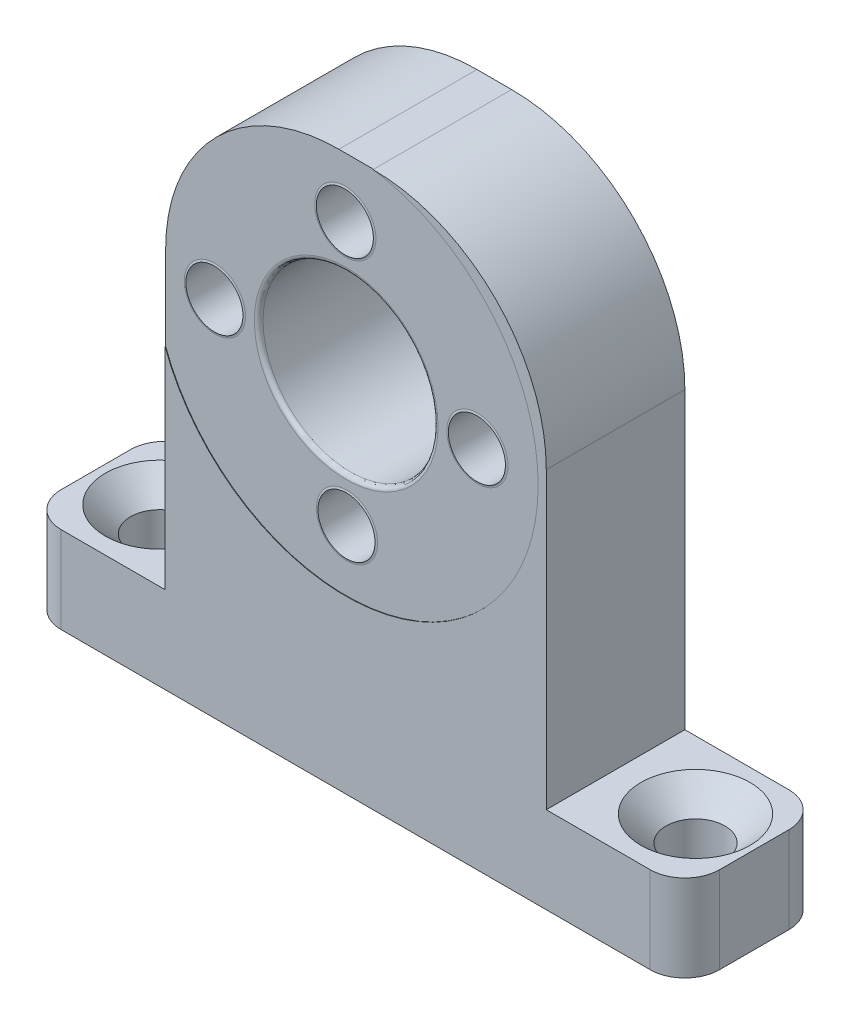
ISO-10303-21;
HEADER;
FILE_DESCRIPTION(('STEP AP214'),'2;1');
FILE_NAME('part.step','',(''),(''),'','','');
FILE_SCHEMA(('AUTOMOTIVE_DESIGN { 1 0 10303 214 1 1 1 1 }'));
ENDSEC;
DATA;
#1=APPLICATION_CONTEXT('core data for automotive mechanical design processes');
#2=APPLICATION_PROTOCOL_DEFINITION('international standard','automotive_design',2000,#1);
#3=PRODUCT_CONTEXT('',#1,'mechanical');
#4=PRODUCT('Part','Part','',(#3));
#5=PRODUCT_RELATED_PRODUCT_CATEGORY('part','',(#4));
#6=PRODUCT_DEFINITION_FORMATION('','',#4);
#7=PRODUCT_DEFINITION_CONTEXT('part definition',#1,'design');
#8=PRODUCT_DEFINITION('design','',#6,#7);
#9=PRODUCT_DEFINITION_SHAPE('','',#8);
#10=(LENGTH_UNIT() NAMED_UNIT(*) SI_UNIT(.MILLI.,.METRE.));
#11=(NAMED_UNIT(*) PLANE_ANGLE_UNIT() SI_UNIT($,.RADIAN.));
#12=(NAMED_UNIT(*) SI_UNIT($,.STERADIAN.) SOLID_ANGLE_UNIT());
#13=UNCERTAINTY_MEASURE_WITH_UNIT(LENGTH_MEASURE(1.E-05),#10,'distance_accuracy_value','');
#14=(GEOMETRIC_REPRESENTATION_CONTEXT(3) GLOBAL_UNCERTAINTY_ASSIGNED_CONTEXT((#13)) GLOBAL_UNIT_ASSIGNED_CONTEXT((#10,
#11,#12)) REPRESENTATION_CONTEXT('',''));
#15=CARTESIAN_POINT('',(0.,0.,0.));
#16=DIRECTION('',(0.,0.,1.));
#17=DIRECTION('',(1.,0.,0.));
#18=AXIS2_PLACEMENT_3D('',#15,#16,#17);
#19=CARTESIAN_POINT('',(0.,0.,8.));
#20=DIRECTION('',(1.,0.,0.));
#21=DIRECTION('',(0.,1.,0.));
#22=AXIS2_PLACEMENT_3D('',#19,#20,#21);
#23=PLANE('',#22);
#24=DIRECTION('',(0.,0.,1.));
#25=VECTOR('',#24,1.);
#26=CARTESIAN_POINT('',(0.,17.1450051665847,7.97));
#27=LINE('',#26,#25);
#28=CARTESIAN_POINT('',(0.,17.1450051665847,7.97));
#29=VERTEX_POINT('',#28);
#30=CARTESIAN_POINT('',(0.,17.1450051665847,8.));
#31=VERTEX_POINT('',#30);
#32=EDGE_CURVE('E217',#29,#31,#27,.T.);
#33=ORIENTED_EDGE('',*,*,#32,.F.);
#34=DIRECTION('',(0.,1.,0.));
#35=VECTOR('',#34,1.);
#36=CARTESIAN_POINT('',(0.,0.,7.97));
#37=LINE('',#36,#35);
#38=CARTESIAN_POINT('',(0.,22.,7.97));
#39=VERTEX_POINT('',#38);
#40=EDGE_CURVE('E72',#29,#39,#37,.T.);
#41=ORIENTED_EDGE('',*,*,#40,.T.);
#42=DIRECTION('',(0.,0.,-1.));
#43=VECTOR('',#42,1.);
#44=CARTESIAN_POINT('',(0.,21.9999999999999,8.));
#45=LINE('',#44,#43);
#46=CARTESIAN_POINT('',(0.,21.9999999999999,0.));
#47=VERTEX_POINT('',#46);
#48=EDGE_CURVE('E260',#39,#47,#45,.T.);
#49=ORIENTED_EDGE('',*,*,#48,.T.);
#50=DIRECTION('',(0.,-1.,0.));
#51=VECTOR('',#50,1.);
#52=CARTESIAN_POINT('',(0.,0.,0.));
#53=LINE('',#52,#51);
#54=CARTESIAN_POINT('',(0.,5.,0.));
#55=VERTEX_POINT('',#54);
#56=EDGE_CURVE('E263',#47,#55,#53,.T.);
#57=ORIENTED_EDGE('',*,*,#56,.T.);
#58=DIRECTION('',(0.,0.,1.));
#59=VECTOR('',#58,1.);
#60=CARTESIAN_POINT('',(0.,5.,0.));
#61=LINE('',#60,#59);
#62=CARTESIAN_POINT('',(0.,5.,8.));
#63=VERTEX_POINT('',#62);
#64=EDGE_CURVE('E255',#55,#63,#61,.T.);
#65=ORIENTED_EDGE('',*,*,#64,.T.);
#66=DIRECTION('',(0.,-1.,0.));
#67=VECTOR('',#66,1.);
#68=CARTESIAN_POINT('',(0.,0.,8.));
#69=LINE('',#68,#67);
#70=EDGE_CURVE('E291',#31,#63,#69,.T.);
#71=ORIENTED_EDGE('',*,*,#70,.F.);
#72=EDGE_LOOP('',(#33,#41,#49,#57,#65,#71));
#73=FACE_BOUND('',#72,.T.);
#74=ADVANCED_FACE('F38',(#73),#23,.F.);
#75=CARTESIAN_POINT('',(10.0000000000001,32.,8.));
#76=DIRECTION('',(0.,-1.,0.));
#77=DIRECTION('',(0.,0.,-1.));
#78=AXIS2_PLACEMENT_3D('',#75,#76,#77);
#79=PLANE('',#78);
#80=DIRECTION('',(0.,0.,1.));
#81=VECTOR('',#80,1.);
#82=CARTESIAN_POINT('',(11.9792655467795,32.,7.97));
#83=LINE('',#82,#81);
#84=CARTESIAN_POINT('',(11.9792655467795,32.,8.));
#85=VERTEX_POINT('',#84);
#86=CARTESIAN_POINT('',(11.9792655467795,32.,7.97));
#87=VERTEX_POINT('',#86);
#88=EDGE_CURVE('E56',#85,#87,#83,.F.);
#89=ORIENTED_EDGE('',*,*,#88,.F.);
#90=DIRECTION('',(-1.,0.,0.));
#91=VECTOR('',#90,1.);
#92=CARTESIAN_POINT('',(10.0000000000001,32.,8.));
#93=LINE('',#92,#91);
#94=CARTESIAN_POINT('',(11.9999999999999,32.,8.));
#95=VERTEX_POINT('',#94);
#96=EDGE_CURVE('E227',#95,#85,#93,.T.);
#97=ORIENTED_EDGE('',*,*,#96,.F.);
#98=DIRECTION('',(0.,0.,-1.));
#99=VECTOR('',#98,1.);
#100=CARTESIAN_POINT('',(11.9999999999999,32.,8.));
#101=LINE('',#100,#99);
#102=CARTESIAN_POINT('',(11.9999999999999,32.,0.));
#103=VERTEX_POINT('',#102);
#104=EDGE_CURVE('E250',#95,#103,#101,.T.);
#105=ORIENTED_EDGE('',*,*,#104,.T.);
#106=DIRECTION('',(-1.,0.,0.));
#107=VECTOR('',#106,1.);
#108=CARTESIAN_POINT('',(10.0000000000001,32.,0.));
#109=LINE('',#108,#107);
#110=CARTESIAN_POINT('',(10.0000000000001,32.,0.));
#111=VERTEX_POINT('',#110);
#112=EDGE_CURVE('E254',#103,#111,#109,.T.);
#113=ORIENTED_EDGE('',*,*,#112,.T.);
#114=DIRECTION('',(0.,0.,-1.));
#115=VECTOR('',#114,1.);
#116=CARTESIAN_POINT('',(10.0000000000001,32.,8.));
#117=LINE('',#116,#115);
#118=CARTESIAN_POINT('',(10.0000000000001,32.,7.97));
#119=VERTEX_POINT('',#118);
#120=EDGE_CURVE('E256',#119,#111,#117,.T.);
#121=ORIENTED_EDGE('',*,*,#120,.F.);
#122=DIRECTION('',(1.,0.,0.));
#123=VECTOR('',#122,1.);
#124=CARTESIAN_POINT('',(10.0000000000001,32.,7.97));
#125=LINE('',#124,#123);
#126=EDGE_CURVE('E79',#119,#87,#125,.T.);
#127=ORIENTED_EDGE('',*,*,#126,.T.);
#128=EDGE_LOOP('',(#89,#97,#105,#113,#121,#127));
#129=FACE_BOUND('',#128,.T.);
#130=ADVANCED_FACE('F402',(#129),#79,.F.);
#131=CARTESIAN_POINT('',(9.99999999999999,22.,8.));
#132=DIRECTION('',(0.,0.,-1.));
#133=DIRECTION('',(-1.,0.,0.));
#134=AXIS2_PLACEMENT_3D('',#131,#132,#133);
#135=PLANE('',#134);
#136=CARTESIAN_POINT('',(10.4197463901163,21.,8.));
#137=DIRECTION('',(0.,0.,-1.));
#138=DIRECTION('',(-1.,0.,0.));
#139=AXIS2_PLACEMENT_3D('',#136,#137,#138);
#140=CIRCLE('',#139,11.11);
#141=EDGE_CURVE('E62',#31,#85,#140,.F.);
#142=ORIENTED_EDGE('',*,*,#141,.F.);
#143=ORIENTED_EDGE('',*,*,#70,.T.);
#144=DIRECTION('',(-1.,0.,0.));
#145=VECTOR('',#144,1.);
#146=CARTESIAN_POINT('',(0.,5.,8.));
#147=LINE('',#146,#145);
#148=CARTESIAN_POINT('',(-6.,5.,8.));
#149=VERTEX_POINT('',#148);
#150=EDGE_CURVE('E205',#63,#149,#147,.T.);
#151=ORIENTED_EDGE('',*,*,#150,.T.);
#152=DIRECTION('',(0.,-1.,0.));
#153=VECTOR('',#152,1.);
#154=CARTESIAN_POINT('',(-6.,0.,8.));
#155=LINE('',#154,#153);
#156=CARTESIAN_POINT('',(-6.,0.,8.));
#157=VERTEX_POINT('',#156);
#158=EDGE_CURVE('E200',#149,#157,#155,.T.);
#159=ORIENTED_EDGE('',*,*,#158,.T.);
#160=DIRECTION('',(1.,0.,0.));
#161=VECTOR('',#160,1.);
#162=CARTESIAN_POINT('',(0.,0.,8.));
#163=LINE('',#162,#161);
#164=CARTESIAN_POINT('',(28.,0.,8.));
#165=VERTEX_POINT('',#164);
#166=EDGE_CURVE('E204',#157,#165,#163,.T.);
#167=ORIENTED_EDGE('',*,*,#166,.T.);
#168=DIRECTION('',(0.,1.,0.));
#169=VECTOR('',#168,1.);
#170=CARTESIAN_POINT('',(28.,5.,8.));
#171=LINE('',#170,#169);
#172=CARTESIAN_POINT('',(28.,5.,8.));
#173=VERTEX_POINT('',#172);
#174=EDGE_CURVE('E206',#165,#173,#171,.T.);
#175=ORIENTED_EDGE('',*,*,#174,.T.);
#176=DIRECTION('',(-1.,0.,0.));
#177=VECTOR('',#176,1.);
#178=CARTESIAN_POINT('',(22.,5.,8.));
#179=LINE('',#178,#177);
#180=CARTESIAN_POINT('',(22.,5.,8.));
#181=VERTEX_POINT('',#180);
#182=EDGE_CURVE('E165',#173,#181,#179,.T.);
#183=ORIENTED_EDGE('',*,*,#182,.T.);
#184=DIRECTION('',(0.,1.,0.));
#185=VECTOR('',#184,1.);
#186=CARTESIAN_POINT('',(22.,0.,8.));
#187=LINE('',#186,#185);
#188=CARTESIAN_POINT('',(22.,21.9999999999999,8.));
#189=VERTEX_POINT('',#188);
#190=EDGE_CURVE('E285',#181,#189,#187,.T.);
#191=ORIENTED_EDGE('',*,*,#190,.T.);
#192=CARTESIAN_POINT('',(12.,22.,8.));
#193=DIRECTION('',(0.,0.,1.));
#194=DIRECTION('',(-1.,0.,0.));
#195=AXIS2_PLACEMENT_3D('',#192,#193,#194);
#196=CIRCLE('',#195,10.);
#197=EDGE_CURVE('E282',#189,#95,#196,.T.);
#198=ORIENTED_EDGE('',*,*,#197,.T.);
#199=ORIENTED_EDGE('',*,*,#96,.T.);
#200=EDGE_LOOP('',(#142,#143,#151,#159,#167,#175,#183,#191,#198,#199));
#201=FACE_BOUND('',#200,.T.);
#202=ADVANCED_FACE('F40',(#201),#135,.F.);
#203=CARTESIAN_POINT('',(0.,0.,8.));
#204=DIRECTION('',(0.,1.,0.));
#205=DIRECTION('',(0.,0.,1.));
#206=AXIS2_PLACEMENT_3D('',#203,#204,#205);
#207=PLANE('',#206);
#208=CARTESIAN_POINT('',(-4.39851416286659,0.,3.90318258406556));
#209=DIRECTION('',(0.,1.,0.));
#210=DIRECTION('',(0.,0.,1.));
#211=AXIS2_PLACEMENT_3D('',#208,#209,#210);
#212=CIRCLE('',#211,1.69999999999999);
#213=CARTESIAN_POINT('',(-4.39851416286659,0.,5.60318258406555));
#214=VERTEX_POINT('',#213);
#215=EDGE_CURVE('E42',#214,#214,#212,.T.);
#216=ORIENTED_EDGE('',*,*,#215,.T.);
#217=EDGE_LOOP('',(#216));
#218=FACE_BOUND('',#217,.T.);
#219=CARTESIAN_POINT('',(26.5165104399769,0.,3.90318258406556));
#220=DIRECTION('',(0.,1.,0.));
#221=DIRECTION('',(0.,0.,1.));
#222=AXIS2_PLACEMENT_3D('',#219,#220,#221);
#223=CIRCLE('',#222,1.69999999999999);
#224=CARTESIAN_POINT('',(26.5165104399769,0.,5.60318258406555));
#225=VERTEX_POINT('',#224);
#226=EDGE_CURVE('E347',#225,#225,#223,.T.);
#227=ORIENTED_EDGE('',*,*,#226,.T.);
#228=EDGE_LOOP('',(#227));
#229=FACE_BOUND('',#228,.T.);
#230=DIRECTION('',(0.,0.,1.));
#231=VECTOR('',#230,1.);
#232=CARTESIAN_POINT('',(-8.,0.,0.));
#233=LINE('',#232,#231);
#234=CARTESIAN_POINT('',(-8.,0.,2.));
#235=VERTEX_POINT('',#234);
#236=CARTESIAN_POINT('',(-8.,0.,6.));
#237=VERTEX_POINT('',#236);
#238=EDGE_CURVE('E241',#235,#237,#233,.T.);
#239=ORIENTED_EDGE('',*,*,#238,.F.);
#240=CARTESIAN_POINT('',(-6.,0.,2.));
#241=DIRECTION('',(0.,1.,0.));
#242=DIRECTION('',(0.,0.,1.));
#243=AXIS2_PLACEMENT_3D('',#240,#241,#242);
#244=CIRCLE('',#243,2.);
#245=CARTESIAN_POINT('',(-6.,0.,0.));
#246=VERTEX_POINT('',#245);
#247=EDGE_CURVE('E223',#235,#246,#244,.F.);
#248=ORIENTED_EDGE('',*,*,#247,.T.);
#249=DIRECTION('',(1.,0.,0.));
#250=VECTOR('',#249,1.);
#251=CARTESIAN_POINT('',(0.,0.,0.));
#252=LINE('',#251,#250);
#253=CARTESIAN_POINT('',(28.,0.,0.));
#254=VERTEX_POINT('',#253);
#255=EDGE_CURVE('E226',#246,#254,#252,.T.);
#256=ORIENTED_EDGE('',*,*,#255,.T.);
#257=CARTESIAN_POINT('',(28.,0.,2.));
#258=DIRECTION('',(0.,1.,0.));
#259=DIRECTION('',(0.,0.,1.));
#260=AXIS2_PLACEMENT_3D('',#257,#258,#259);
#261=CIRCLE('',#260,2.);
#262=CARTESIAN_POINT('',(30.,0.,2.));
#263=VERTEX_POINT('',#262);
#264=EDGE_CURVE('E235',#254,#263,#261,.F.);
#265=ORIENTED_EDGE('',*,*,#264,.T.);
#266=DIRECTION('',(0.,0.,1.));
#267=VECTOR('',#266,1.);
#268=CARTESIAN_POINT('',(30.,0.,0.));
#269=LINE('',#268,#267);
#270=CARTESIAN_POINT('',(30.,0.,6.));
#271=VERTEX_POINT('',#270);
#272=EDGE_CURVE('E234',#263,#271,#269,.T.);
#273=ORIENTED_EDGE('',*,*,#272,.T.);
#274=CARTESIAN_POINT('',(28.,0.,6.));
#275=DIRECTION('',(0.,1.,0.));
#276=DIRECTION('',(0.,0.,1.));
#277=AXIS2_PLACEMENT_3D('',#274,#275,#276);
#278=CIRCLE('',#277,2.);
#279=EDGE_CURVE('E187',#271,#165,#278,.F.);
#280=ORIENTED_EDGE('',*,*,#279,.T.);
#281=ORIENTED_EDGE('',*,*,#166,.F.);
#282=CARTESIAN_POINT('',(-6.,0.,6.));
#283=DIRECTION('',(0.,1.,0.));
#284=DIRECTION('',(0.,0.,1.));
#285=AXIS2_PLACEMENT_3D('',#282,#283,#284);
#286=CIRCLE('',#285,2.);
#287=EDGE_CURVE('E228',#157,#237,#286,.F.);
#288=ORIENTED_EDGE('',*,*,#287,.T.);
#289=EDGE_LOOP('',(#239,#248,#256,#265,#273,#280,#281,#288));
#290=FACE_BOUND('',#289,.T.);
#291=ADVANCED_FACE('F430',(#218,#229,#290),#207,.F.);
#292=CARTESIAN_POINT('',(22.,0.,8.));
#293=DIRECTION('',(-1.,0.,0.));
#294=DIRECTION('',(0.,-1.,0.));
#295=AXIS2_PLACEMENT_3D('',#292,#293,#294);
#296=PLANE('',#295);
#297=ORIENTED_EDGE('',*,*,#190,.F.);
#298=DIRECTION('',(0.,0.,1.));
#299=VECTOR('',#298,1.);
#300=CARTESIAN_POINT('',(22.,5.,0.));
#301=LINE('',#300,#299);
#302=CARTESIAN_POINT('',(22.,5.,0.));
#303=VERTEX_POINT('',#302);
#304=EDGE_CURVE('E183',#303,#181,#301,.T.);
#305=ORIENTED_EDGE('',*,*,#304,.F.);
#306=DIRECTION('',(0.,1.,0.));
#307=VECTOR('',#306,1.);
#308=CARTESIAN_POINT('',(22.,0.,0.));
#309=LINE('',#308,#307);
#310=CARTESIAN_POINT('',(22.,21.9999999999999,0.));
#311=VERTEX_POINT('',#310);
#312=EDGE_CURVE('E231',#303,#311,#309,.T.);
#313=ORIENTED_EDGE('',*,*,#312,.T.);
#314=DIRECTION('',(0.,0.,-1.));
#315=VECTOR('',#314,1.);
#316=CARTESIAN_POINT('',(22.,21.9999999999999,8.));
#317=LINE('',#316,#315);
#318=EDGE_CURVE('E245',#189,#311,#317,.T.);
#319=ORIENTED_EDGE('',*,*,#318,.F.);
#320=EDGE_LOOP('',(#297,#305,#313,#319));
#321=FACE_BOUND('',#320,.T.);
#322=ADVANCED_FACE('F448',(#321),#296,.F.);
#323=CARTESIAN_POINT('',(12.,22.,8.));
#324=DIRECTION('',(0.,0.,-1.));
#325=DIRECTION('',(-1.,0.,0.));
#326=AXIS2_PLACEMENT_3D('',#323,#324,#325);
#327=CYLINDRICAL_SURFACE('',#326,10.);
#328=CARTESIAN_POINT('',(12.,22.,0.));
#329=DIRECTION('',(0.,0.,1.));
#330=DIRECTION('',(-1.,0.,0.));
#331=AXIS2_PLACEMENT_3D('',#328,#329,#330);
#332=CIRCLE('',#331,10.);
#333=EDGE_CURVE('E249',#311,#103,#332,.T.);
#334=ORIENTED_EDGE('',*,*,#333,.T.);
#335=ORIENTED_EDGE('',*,*,#104,.F.);
#336=ORIENTED_EDGE('',*,*,#197,.F.);
#337=ORIENTED_EDGE('',*,*,#318,.T.);
#338=EDGE_LOOP('',(#334,#335,#336,#337));
#339=FACE_BOUND('',#338,.T.);
#340=ADVANCED_FACE('F451',(#339),#327,.T.);
#341=CARTESIAN_POINT('',(9.99999999999999,22.,8.));
#342=DIRECTION('',(0.,0.,-1.));
#343=DIRECTION('',(-1.,0.,0.));
#344=AXIS2_PLACEMENT_3D('',#341,#342,#343);
#345=CYLINDRICAL_SURFACE('',#344,10.);
#346=ORIENTED_EDGE('',*,*,#48,.F.);
#347=CARTESIAN_POINT('',(9.99999999999999,22.,7.97));
#348=DIRECTION('',(0.,0.,-1.));
#349=DIRECTION('',(-1.,0.,0.));
#350=AXIS2_PLACEMENT_3D('',#347,#348,#349);
#351=CIRCLE('',#350,10.);
#352=EDGE_CURVE('E76',#39,#119,#351,.T.);
#353=ORIENTED_EDGE('',*,*,#352,.T.);
#354=ORIENTED_EDGE('',*,*,#120,.T.);
#355=CARTESIAN_POINT('',(9.99999999999999,22.,0.));
#356=DIRECTION('',(0.,0.,1.));
#357=DIRECTION('',(-1.,0.,0.));
#358=AXIS2_PLACEMENT_3D('',#355,#356,#357);
#359=CIRCLE('',#358,10.);
#360=EDGE_CURVE('E259',#111,#47,#359,.T.);
#361=ORIENTED_EDGE('',*,*,#360,.T.);
#362=EDGE_LOOP('',(#346,#353,#354,#361));
#363=FACE_BOUND('',#362,.T.);
#364=ADVANCED_FACE('F400',(#363),#345,.T.);
#365=CARTESIAN_POINT('',(9.99999999999999,22.,0.));
#366=DIRECTION('',(0.,0.,-1.));
#367=DIRECTION('',(-1.,0.,0.));
#368=AXIS2_PLACEMENT_3D('',#365,#366,#367);
#369=PLANE('',#368);
#370=CARTESIAN_POINT('',(10.3716037784549,28.5747618244784,0.));
#371=DIRECTION('',(0.,0.,-1.));
#372=DIRECTION('',(-1.,0.,0.));
#373=AXIS2_PLACEMENT_3D('',#370,#371,#372);
#374=CIRCLE('',#373,1.64812663613721);
#375=CARTESIAN_POINT('',(8.72347714231774,28.5747618244784,0.));
#376=VERTEX_POINT('',#375);
#377=EDGE_CURVE('E384',#376,#376,#374,.F.);
#378=ORIENTED_EDGE('',*,*,#377,.T.);
#379=EDGE_LOOP('',(#378));
#380=FACE_BOUND('',#379,.T.);
#381=CARTESIAN_POINT('',(17.9945082145949,21.0481426116611,0.));
#382=DIRECTION('',(0.,0.,-1.));
#383=DIRECTION('',(-1.,0.,0.));
#384=AXIS2_PLACEMENT_3D('',#381,#382,#383);
#385=CIRCLE('',#384,1.64812663613686);
#386=CARTESIAN_POINT('',(16.346381578458,21.0481426116611,0.));
#387=VERTEX_POINT('',#386);
#388=EDGE_CURVE('E319',#387,#387,#385,.F.);
#389=ORIENTED_EDGE('',*,*,#388,.T.);
#390=EDGE_LOOP('',(#389));
#391=FACE_BOUND('',#390,.T.);
#392=CARTESIAN_POINT('',(10.4678890017777,13.4252381755212,0.));
#393=DIRECTION('',(0.,0.,-1.));
#394=DIRECTION('',(-1.,0.,0.));
#395=AXIS2_PLACEMENT_3D('',#392,#393,#394);
#396=CIRCLE('',#395,1.64812663613703);
#397=CARTESIAN_POINT('',(8.81976236564062,13.4252381755212,0.));
#398=VERTEX_POINT('',#397);
#399=EDGE_CURVE('E357',#398,#398,#396,.F.);
#400=ORIENTED_EDGE('',*,*,#399,.T.);
#401=EDGE_LOOP('',(#400));
#402=FACE_BOUND('',#401,.T.);
#403=CARTESIAN_POINT('',(2.8449845656377,20.9518573883384,0.));
#404=DIRECTION('',(0.,0.,-1.));
#405=DIRECTION('',(-1.,0.,0.));
#406=AXIS2_PLACEMENT_3D('',#403,#404,#405);
#407=CIRCLE('',#406,1.64812663613732);
#408=CARTESIAN_POINT('',(1.19685792950037,20.9518573883384,0.));
#409=VERTEX_POINT('',#408);
#410=EDGE_CURVE('E376',#409,#409,#407,.F.);
#411=ORIENTED_EDGE('',*,*,#410,.T.);
#412=EDGE_LOOP('',(#411));
#413=FACE_BOUND('',#412,.T.);
#414=CARTESIAN_POINT('',(10.4197463901163,21.,0.));
#415=DIRECTION('',(0.,0.,-1.));
#416=DIRECTION('',(-1.,0.,0.));
#417=AXIS2_PLACEMENT_3D('',#414,#415,#416);
#418=CIRCLE('',#417,5.05);
#419=CARTESIAN_POINT('',(5.3697463901163,21.,0.));
#420=VERTEX_POINT('',#419);
#421=EDGE_CURVE('E194',#420,#420,#418,.F.);
#422=ORIENTED_EDGE('',*,*,#421,.T.);
#423=EDGE_LOOP('',(#422));
#424=FACE_BOUND('',#423,.T.);
#425=ORIENTED_EDGE('',*,*,#255,.F.);
#426=DIRECTION('',(0.,-1.,0.));
#427=VECTOR('',#426,1.);
#428=CARTESIAN_POINT('',(-6.,22.,0.));
#429=LINE('',#428,#427);
#430=CARTESIAN_POINT('',(-6.,5.,0.));
#431=VERTEX_POINT('',#430);
#432=EDGE_CURVE('E218',#246,#431,#429,.F.);
#433=ORIENTED_EDGE('',*,*,#432,.T.);
#434=DIRECTION('',(-1.,0.,0.));
#435=VECTOR('',#434,1.);
#436=CARTESIAN_POINT('',(0.,5.,0.));
#437=LINE('',#436,#435);
#438=EDGE_CURVE('E213',#55,#431,#437,.T.);
#439=ORIENTED_EDGE('',*,*,#438,.F.);
#440=ORIENTED_EDGE('',*,*,#56,.F.);
#441=ORIENTED_EDGE('',*,*,#360,.F.);
#442=ORIENTED_EDGE('',*,*,#112,.F.);
#443=ORIENTED_EDGE('',*,*,#333,.F.);
#444=ORIENTED_EDGE('',*,*,#312,.F.);
#445=DIRECTION('',(-1.,0.,0.));
#446=VECTOR('',#445,1.);
#447=CARTESIAN_POINT('',(22.,5.,0.));
#448=LINE('',#447,#446);
#449=CARTESIAN_POINT('',(28.,5.,0.));
#450=VERTEX_POINT('',#449);
#451=EDGE_CURVE('E199',#450,#303,#448,.T.);
#452=ORIENTED_EDGE('',*,*,#451,.F.);
#453=DIRECTION('',(0.,1.,0.));
#454=VECTOR('',#453,1.);
#455=CARTESIAN_POINT('',(28.,22.,0.));
#456=LINE('',#455,#454);
#457=EDGE_CURVE('E172',#450,#254,#456,.F.);
#458=ORIENTED_EDGE('',*,*,#457,.T.);
#459=EDGE_LOOP('',(#425,#433,#439,#440,#441,#442,#443,#444,#452,#458));
#460=FACE_BOUND('',#459,.T.);
#461=ADVANCED_FACE('F411',(#380,#391,#402,#413,#424,#460),#369,.T.);
#462=CARTESIAN_POINT('',(22.,5.,0.));
#463=DIRECTION('',(0.,1.,0.));
#464=DIRECTION('',(0.,0.,1.));
#465=AXIS2_PLACEMENT_3D('',#462,#463,#464);
#466=PLANE('',#465);
#467=CARTESIAN_POINT('',(26.5165104399769,5.,3.90318258406556));
#468=DIRECTION('',(0.,1.,0.));
#469=DIRECTION('',(0.,0.,1.));
#470=AXIS2_PLACEMENT_3D('',#467,#468,#469);
#471=CIRCLE('',#470,3.15);
#472=CARTESIAN_POINT('',(26.5165104399769,5.,7.05318258406556));
#473=VERTEX_POINT('',#472);
#474=EDGE_CURVE('E360',#473,#473,#471,.T.);
#475=ORIENTED_EDGE('',*,*,#474,.F.);
#476=EDGE_LOOP('',(#475));
#477=FACE_BOUND('',#476,.T.);
#478=ORIENTED_EDGE('',*,*,#182,.F.);
#479=CARTESIAN_POINT('',(28.,5.,6.));
#480=DIRECTION('',(0.,1.,0.));
#481=DIRECTION('',(0.,0.,1.));
#482=AXIS2_PLACEMENT_3D('',#479,#480,#481);
#483=CIRCLE('',#482,2.);
#484=CARTESIAN_POINT('',(30.,5.,6.));
#485=VERTEX_POINT('',#484);
#486=EDGE_CURVE('E160',#173,#485,#483,.T.);
#487=ORIENTED_EDGE('',*,*,#486,.T.);
#488=DIRECTION('',(0.,0.,1.));
#489=VECTOR('',#488,1.);
#490=CARTESIAN_POINT('',(30.,5.,0.));
#491=LINE('',#490,#489);
#492=CARTESIAN_POINT('',(30.,5.,2.));
#493=VERTEX_POINT('',#492);
#494=EDGE_CURVE('E163',#493,#485,#491,.T.);
#495=ORIENTED_EDGE('',*,*,#494,.F.);
#496=CARTESIAN_POINT('',(28.,5.,2.));
#497=DIRECTION('',(0.,1.,0.));
#498=DIRECTION('',(0.,0.,1.));
#499=AXIS2_PLACEMENT_3D('',#496,#497,#498);
#500=CIRCLE('',#499,2.);
#501=EDGE_CURVE('E171',#493,#450,#500,.T.);
#502=ORIENTED_EDGE('',*,*,#501,.T.);
#503=ORIENTED_EDGE('',*,*,#451,.T.);
#504=ORIENTED_EDGE('',*,*,#304,.T.);
#505=EDGE_LOOP('',(#478,#487,#495,#502,#503,#504));
#506=FACE_BOUND('',#505,.T.);
#507=ADVANCED_FACE('F162',(#477,#506),#466,.T.);
#508=CARTESIAN_POINT('',(30.,0.,0.));
#509=DIRECTION('',(1.,0.,0.));
#510=DIRECTION('',(0.,0.,-1.));
#511=AXIS2_PLACEMENT_3D('',#508,#509,#510);
#512=PLANE('',#511);
#513=ORIENTED_EDGE('',*,*,#494,.T.);
#514=DIRECTION('',(0.,1.,0.));
#515=VECTOR('',#514,1.);
#516=CARTESIAN_POINT('',(30.,0.,6.));
#517=LINE('',#516,#515);
#518=EDGE_CURVE('E178',#485,#271,#517,.F.);
#519=ORIENTED_EDGE('',*,*,#518,.T.);
#520=ORIENTED_EDGE('',*,*,#272,.F.);
#521=DIRECTION('',(0.,1.,0.));
#522=VECTOR('',#521,1.);
#523=CARTESIAN_POINT('',(30.,0.,2.));
#524=LINE('',#523,#522);
#525=EDGE_CURVE('E181',#263,#493,#524,.T.);
#526=ORIENTED_EDGE('',*,*,#525,.T.);
#527=EDGE_LOOP('',(#513,#519,#520,#526));
#528=FACE_BOUND('',#527,.T.);
#529=ADVANCED_FACE('F176',(#528),#512,.T.);
#530=CARTESIAN_POINT('',(-8.,0.,0.));
#531=DIRECTION('',(-1.,0.,0.));
#532=DIRECTION('',(0.,0.,1.));
#533=AXIS2_PLACEMENT_3D('',#530,#531,#532);
#534=PLANE('',#533);
#535=DIRECTION('',(0.,0.,1.));
#536=VECTOR('',#535,1.);
#537=CARTESIAN_POINT('',(-8.,5.,0.));
#538=LINE('',#537,#536);
#539=CARTESIAN_POINT('',(-8.,5.,2.));
#540=VERTEX_POINT('',#539);
#541=CARTESIAN_POINT('',(-8.,5.,6.));
#542=VERTEX_POINT('',#541);
#543=EDGE_CURVE('E212',#540,#542,#538,.T.);
#544=ORIENTED_EDGE('',*,*,#543,.F.);
#545=DIRECTION('',(0.,-1.,0.));
#546=VECTOR('',#545,1.);
#547=CARTESIAN_POINT('',(-8.,0.,2.));
#548=LINE('',#547,#546);
#549=EDGE_CURVE('E191',#540,#235,#548,.T.);
#550=ORIENTED_EDGE('',*,*,#549,.T.);
#551=ORIENTED_EDGE('',*,*,#238,.T.);
#552=DIRECTION('',(0.,-1.,0.));
#553=VECTOR('',#552,1.);
#554=CARTESIAN_POINT('',(-8.,5.,6.));
#555=LINE('',#554,#553);
#556=EDGE_CURVE('E242',#237,#542,#555,.F.);
#557=ORIENTED_EDGE('',*,*,#556,.T.);
#558=EDGE_LOOP('',(#544,#550,#551,#557));
#559=FACE_BOUND('',#558,.T.);
#560=ADVANCED_FACE('F433',(#559),#534,.T.);
#561=CARTESIAN_POINT('',(0.,5.,0.));
#562=DIRECTION('',(0.,1.,0.));
#563=DIRECTION('',(-1.,0.,0.));
#564=AXIS2_PLACEMENT_3D('',#561,#562,#563);
#565=PLANE('',#564);
#566=CARTESIAN_POINT('',(-4.39851416286659,5.,3.90318258406556));
#567=DIRECTION('',(0.,1.,0.));
#568=DIRECTION('',(0.,0.,1.));
#569=AXIS2_PLACEMENT_3D('',#566,#567,#568);
#570=CIRCLE('',#569,3.15);
#571=CARTESIAN_POINT('',(-4.39851416286659,5.,7.05318258406556));
#572=VERTEX_POINT('',#571);
#573=EDGE_CURVE('E783',#572,#572,#570,.T.);
#574=ORIENTED_EDGE('',*,*,#573,.F.);
#575=EDGE_LOOP('',(#574));
#576=FACE_BOUND('',#575,.T.);
#577=ORIENTED_EDGE('',*,*,#438,.T.);
#578=CARTESIAN_POINT('',(-6.,5.,2.));
#579=DIRECTION('',(0.,1.,0.));
#580=DIRECTION('',(-1.,0.,0.));
#581=AXIS2_PLACEMENT_3D('',#578,#579,#580);
#582=CIRCLE('',#581,2.);
#583=EDGE_CURVE('E209',#431,#540,#582,.T.);
#584=ORIENTED_EDGE('',*,*,#583,.T.);
#585=ORIENTED_EDGE('',*,*,#543,.T.);
#586=CARTESIAN_POINT('',(-6.,5.,6.));
#587=DIRECTION('',(0.,1.,0.));
#588=DIRECTION('',(-1.,0.,0.));
#589=AXIS2_PLACEMENT_3D('',#586,#587,#588);
#590=CIRCLE('',#589,2.);
#591=EDGE_CURVE('E214',#542,#149,#590,.T.);
#592=ORIENTED_EDGE('',*,*,#591,.T.);
#593=ORIENTED_EDGE('',*,*,#150,.F.);
#594=ORIENTED_EDGE('',*,*,#64,.F.);
#595=EDGE_LOOP('',(#577,#584,#585,#592,#593,#594));
#596=FACE_BOUND('',#595,.T.);
#597=ADVANCED_FACE('F419',(#576,#596),#565,.T.);
#598=CARTESIAN_POINT('',(-6.,0.,2.));
#599=DIRECTION('',(0.,-1.,0.));
#600=DIRECTION('',(0.,0.,-1.));
#601=AXIS2_PLACEMENT_3D('',#598,#599,#600);
#602=CYLINDRICAL_SURFACE('',#601,2.);
#603=ORIENTED_EDGE('',*,*,#583,.F.);
#604=ORIENTED_EDGE('',*,*,#432,.F.);
#605=ORIENTED_EDGE('',*,*,#247,.F.);
#606=ORIENTED_EDGE('',*,*,#549,.F.);
#607=EDGE_LOOP('',(#603,#604,#605,#606));
#608=FACE_BOUND('',#607,.T.);
#609=ADVANCED_FACE('F436',(#608),#602,.T.);
#610=CARTESIAN_POINT('',(-6.,22.,6.));
#611=DIRECTION('',(0.,1.,0.));
#612=DIRECTION('',(0.,0.,1.));
#613=AXIS2_PLACEMENT_3D('',#610,#611,#612);
#614=CYLINDRICAL_SURFACE('',#613,2.);
#615=ORIENTED_EDGE('',*,*,#591,.F.);
#616=ORIENTED_EDGE('',*,*,#556,.F.);
#617=ORIENTED_EDGE('',*,*,#287,.F.);
#618=ORIENTED_EDGE('',*,*,#158,.F.);
#619=EDGE_LOOP('',(#615,#616,#617,#618));
#620=FACE_BOUND('',#619,.T.);
#621=ADVANCED_FACE('F426',(#620),#614,.T.);
#622=CARTESIAN_POINT('',(28.,22.,6.));
#623=DIRECTION('',(0.,-1.,0.));
#624=DIRECTION('',(0.,0.,-1.));
#625=AXIS2_PLACEMENT_3D('',#622,#623,#624);
#626=CYLINDRICAL_SURFACE('',#625,2.);
#627=ORIENTED_EDGE('',*,*,#279,.F.);
#628=ORIENTED_EDGE('',*,*,#518,.F.);
#629=ORIENTED_EDGE('',*,*,#486,.F.);
#630=ORIENTED_EDGE('',*,*,#174,.F.);
#631=EDGE_LOOP('',(#627,#628,#629,#630));
#632=FACE_BOUND('',#631,.T.);
#633=ADVANCED_FACE('F186',(#632),#626,.T.);
#634=CARTESIAN_POINT('',(28.,0.,2.));
#635=DIRECTION('',(0.,1.,0.));
#636=DIRECTION('',(0.,0.,1.));
#637=AXIS2_PLACEMENT_3D('',#634,#635,#636);
#638=CYLINDRICAL_SURFACE('',#637,2.);
#639=ORIENTED_EDGE('',*,*,#264,.F.);
#640=ORIENTED_EDGE('',*,*,#457,.F.);
#641=ORIENTED_EDGE('',*,*,#501,.F.);
#642=ORIENTED_EDGE('',*,*,#525,.F.);
#643=EDGE_LOOP('',(#639,#640,#641,#642));
#644=FACE_BOUND('',#643,.T.);
#645=ADVANCED_FACE('F443',(#644),#638,.T.);
#646=CARTESIAN_POINT('',(10.4197463901163,21.,7.97));
#647=DIRECTION('',(0.,0.,-1.));
#648=DIRECTION('',(-0.00921530313689061,0.999957538192545,0.));
#649=AXIS2_PLACEMENT_3D('',#646,#647,#648);
#650=PLANE('',#649);
#651=CARTESIAN_POINT('',(10.4197463901163,21.,7.97));
#652=DIRECTION('',(0.,0.,-1.));
#653=DIRECTION('',(-0.00921530313689061,0.999957538192545,0.));
#654=AXIS2_PLACEMENT_3D('',#651,#652,#653);
#655=CIRCLE('',#654,5.3025);
#656=CARTESIAN_POINT('',(10.3708822452329,26.3022748462659,7.97));
#657=VERTEX_POINT('',#656);
#658=EDGE_CURVE('E48',#657,#657,#655,.F.);
#659=ORIENTED_EDGE('',*,*,#658,.F.);
#660=EDGE_LOOP('',(#659));
#661=FACE_BOUND('',#660,.T.);
#662=CARTESIAN_POINT('',(10.4678890017777,13.4252381755212,7.97));
#663=DIRECTION('',(0.,0.,-1.));
#664=DIRECTION('',(-0.00921530313689061,0.999957538192545,0.));
#665=AXIS2_PLACEMENT_3D('',#662,#663,#664);
#666=CIRCLE('',#665,1.76750000000017);
#667=CARTESIAN_POINT('',(10.4516009534832,15.1926631242767,7.97));
#668=VERTEX_POINT('',#667);
#669=EDGE_CURVE('E331',#668,#668,#666,.F.);
#670=ORIENTED_EDGE('',*,*,#669,.F.);
#671=EDGE_LOOP('',(#670));
#672=FACE_BOUND('',#671,.T.);
#673=CARTESIAN_POINT('',(2.8449845656377,20.9518573883384,7.97));
#674=DIRECTION('',(0.,0.,-1.));
#675=DIRECTION('',(-0.00921530313689061,0.999957538192545,0.));
#676=AXIS2_PLACEMENT_3D('',#673,#674,#675);
#677=CIRCLE('',#676,1.76750000000046);
#678=CARTESIAN_POINT('',(2.82869651734324,22.7192823370942,7.97));
#679=VERTEX_POINT('',#678);
#680=EDGE_CURVE('E335',#679,#679,#677,.F.);
#681=ORIENTED_EDGE('',*,*,#680,.F.);
#682=EDGE_LOOP('',(#681));
#683=FACE_BOUND('',#682,.T.);
#684=CARTESIAN_POINT('',(10.3716037784549,28.5747618244784,7.97));
#685=DIRECTION('',(0.,0.,-1.));
#686=DIRECTION('',(-0.00921530313689061,0.999957538192545,0.));
#687=AXIS2_PLACEMENT_3D('',#684,#685,#686);
#688=CIRCLE('',#687,1.76750000000034);
#689=CARTESIAN_POINT('',(10.3553157301605,30.342186773234,7.97));
#690=VERTEX_POINT('',#689);
#691=EDGE_CURVE('E339',#690,#690,#688,.F.);
#692=ORIENTED_EDGE('',*,*,#691,.F.);
#693=EDGE_LOOP('',(#692));
#694=FACE_BOUND('',#693,.T.);
#695=CARTESIAN_POINT('',(17.9945082145949,21.0481426116611,7.97));
#696=DIRECTION('',(0.,0.,-1.));
#697=DIRECTION('',(-0.00921530313689061,0.999957538192545,0.));
#698=AXIS2_PLACEMENT_3D('',#695,#696,#697);
#699=CIRCLE('',#698,1.7675);
#700=CARTESIAN_POINT('',(17.9782201663004,22.8155675604164,7.97));
#701=VERTEX_POINT('',#700);
#702=EDGE_CURVE('E329',#701,#701,#699,.F.);
#703=ORIENTED_EDGE('',*,*,#702,.F.);
#704=EDGE_LOOP('',(#703));
#705=FACE_BOUND('',#704,.T.);
#706=CARTESIAN_POINT('',(10.4197463901163,21.,7.97));
#707=DIRECTION('',(0.,0.,-1.));
#708=DIRECTION('',(-0.00921530313689061,0.999957538192545,0.));
#709=AXIS2_PLACEMENT_3D('',#706,#707,#708);
#710=CIRCLE('',#709,11.11);
#711=EDGE_CURVE('E326',#87,#29,#710,.T.);
#712=ORIENTED_EDGE('',*,*,#711,.F.);
#713=ORIENTED_EDGE('',*,*,#126,.F.);
#714=ORIENTED_EDGE('',*,*,#352,.F.);
#715=ORIENTED_EDGE('',*,*,#40,.F.);
#716=EDGE_LOOP('',(#712,#713,#714,#715));
#717=FACE_BOUND('',#716,.T.);
#718=ADVANCED_FACE('F453',(#661,#672,#683,#694,#705,#717),#650,.F.);
#719=CARTESIAN_POINT('',(10.4197463901163,21.,7.97));
#720=DIRECTION('',(0.,0.,1.));
#721=DIRECTION('',(0.00921530313689061,-0.999957538192545,0.));
#722=AXIS2_PLACEMENT_3D('',#719,#720,#721);
#723=CYLINDRICAL_SURFACE('',#722,11.11);
#724=ORIENTED_EDGE('',*,*,#32,.T.);
#725=ORIENTED_EDGE('',*,*,#141,.T.);
#726=ORIENTED_EDGE('',*,*,#88,.T.);
#727=ORIENTED_EDGE('',*,*,#711,.T.);
#728=EDGE_LOOP('',(#724,#725,#726,#727));
#729=FACE_BOUND('',#728,.T.);
#730=ADVANCED_FACE('F452',(#729),#723,.F.);
#731=CARTESIAN_POINT('',(10.4678890017777,13.4252381755212,8.2225));
#732=DIRECTION('',(0.,0.,-1.));
#733=DIRECTION('',(-0.00921530313689061,0.999957538192545,0.));
#734=AXIS2_PLACEMENT_3D('',#731,#732,#733);
#735=TOROIDAL_SURFACE('',#734,1.76750000000017,0.2525);
#736=ORIENTED_EDGE('',*,*,#669,.T.);
#737=EDGE_LOOP('',(#736));
#738=FACE_BOUND('',#737,.T.);
#739=CARTESIAN_POINT('',(10.4678890017777,13.4252381755212,8.));
#740=DIRECTION('',(0.,0.,-1.));
#741=DIRECTION('',(-1.,0.,0.));
#742=AXIS2_PLACEMENT_3D('',#739,#740,#741);
#743=CIRCLE('',#742,1.64812663613703);
#744=CARTESIAN_POINT('',(8.81976236564062,13.4252381755212,8.));
#745=VERTEX_POINT('',#744);
#746=EDGE_CURVE('E350',#745,#745,#743,.F.);
#747=ORIENTED_EDGE('',*,*,#746,.F.);
#748=EDGE_LOOP('',(#747));
#749=FACE_BOUND('',#748,.T.);
#750=ADVANCED_FACE('F460',(#738,#749),#735,.F.);
#751=CARTESIAN_POINT('',(2.8449845656377,20.9518573883384,8.2225));
#752=DIRECTION('',(0.,0.,-1.));
#753=DIRECTION('',(-0.00921530313689061,0.999957538192545,0.));
#754=AXIS2_PLACEMENT_3D('',#751,#752,#753);
#755=TOROIDAL_SURFACE('',#754,1.76750000000046,0.2525);
#756=ORIENTED_EDGE('',*,*,#680,.T.);
#757=EDGE_LOOP('',(#756));
#758=FACE_BOUND('',#757,.T.);
#759=CARTESIAN_POINT('',(2.8449845656377,20.9518573883384,8.));
#760=DIRECTION('',(0.,0.,-1.));
#761=DIRECTION('',(-1.,0.,0.));
#762=AXIS2_PLACEMENT_3D('',#759,#760,#761);
#763=CIRCLE('',#762,1.64812663613732);
#764=CARTESIAN_POINT('',(1.19685792950037,20.9518573883384,8.));
#765=VERTEX_POINT('',#764);
#766=EDGE_CURVE('E372',#765,#765,#763,.F.);
#767=ORIENTED_EDGE('',*,*,#766,.F.);
#768=EDGE_LOOP('',(#767));
#769=FACE_BOUND('',#768,.T.);
#770=ADVANCED_FACE('F507',(#758,#769),#755,.F.);
#771=CARTESIAN_POINT('',(10.3716037784549,28.5747618244784,8.2225));
#772=DIRECTION('',(0.,0.,-1.));
#773=DIRECTION('',(-0.00921530313689061,0.999957538192545,0.));
#774=AXIS2_PLACEMENT_3D('',#771,#772,#773);
#775=TOROIDAL_SURFACE('',#774,1.76750000000034,0.2525);
#776=ORIENTED_EDGE('',*,*,#691,.T.);
#777=EDGE_LOOP('',(#776));
#778=FACE_BOUND('',#777,.T.);
#779=CARTESIAN_POINT('',(10.3716037784549,28.5747618244784,8.));
#780=DIRECTION('',(0.,0.,-1.));
#781=DIRECTION('',(-1.,0.,0.));
#782=AXIS2_PLACEMENT_3D('',#779,#780,#781);
#783=CIRCLE('',#782,1.64812663613721);
#784=CARTESIAN_POINT('',(8.72347714231774,28.5747618244784,8.));
#785=VERTEX_POINT('',#784);
#786=EDGE_CURVE('E380',#785,#785,#783,.F.);
#787=ORIENTED_EDGE('',*,*,#786,.F.);
#788=EDGE_LOOP('',(#787));
#789=FACE_BOUND('',#788,.T.);
#790=ADVANCED_FACE('F503',(#778,#789),#775,.F.);
#791=CARTESIAN_POINT('',(17.9945082145949,21.0481426116611,8.2225));
#792=DIRECTION('',(0.,0.,-1.));
#793=DIRECTION('',(-0.00921530313689061,0.999957538192545,0.));
#794=AXIS2_PLACEMENT_3D('',#791,#792,#793);
#795=TOROIDAL_SURFACE('',#794,1.7675,0.2525);
#796=ORIENTED_EDGE('',*,*,#702,.T.);
#797=EDGE_LOOP('',(#796));
#798=FACE_BOUND('',#797,.T.);
#799=CARTESIAN_POINT('',(17.9945082145949,21.0481426116611,8.));
#800=DIRECTION('',(0.,0.,-1.));
#801=DIRECTION('',(-1.,0.,0.));
#802=AXIS2_PLACEMENT_3D('',#799,#800,#801);
#803=CIRCLE('',#802,1.64812663613686);
#804=CARTESIAN_POINT('',(16.346381578458,21.0481426116611,8.));
#805=VERTEX_POINT('',#804);
#806=EDGE_CURVE('E388',#805,#805,#803,.F.);
#807=ORIENTED_EDGE('',*,*,#806,.F.);
#808=EDGE_LOOP('',(#807));
#809=FACE_BOUND('',#808,.T.);
#810=ADVANCED_FACE('F500',(#798,#809),#795,.F.);
#811=CARTESIAN_POINT('',(10.4197463901163,21.,-4.15));
#812=DIRECTION('',(0.,0.,1.));
#813=DIRECTION('',(0.00921530313689061,-0.999957538192545,0.));
#814=AXIS2_PLACEMENT_3D('',#811,#812,#813);
#815=CYLINDRICAL_SURFACE('',#814,5.05);
#816=ORIENTED_EDGE('',*,*,#421,.F.);
#817=EDGE_LOOP('',(#816));
#818=FACE_BOUND('',#817,.T.);
#819=CARTESIAN_POINT('',(10.4197463901163,21.,7.7175));
#820=DIRECTION('',(0.,0.,-1.));
#821=DIRECTION('',(-0.00921530313689061,0.999957538192545,0.));
#822=AXIS2_PLACEMENT_3D('',#819,#820,#821);
#823=CIRCLE('',#822,5.05);
#824=CARTESIAN_POINT('',(10.373209109275,26.0497855678723,7.7175));
#825=VERTEX_POINT('',#824);
#826=EDGE_CURVE('E11',#825,#825,#823,.T.);
#827=ORIENTED_EDGE('',*,*,#826,.F.);
#828=EDGE_LOOP('',(#827));
#829=FACE_BOUND('',#828,.T.);
#830=ADVANCED_FACE('F498',(#818,#829),#815,.F.);
#831=CARTESIAN_POINT('',(10.4197463901163,21.,7.7175));
#832=DIRECTION('',(0.,0.,-1.));
#833=DIRECTION('',(-0.00921530313689061,0.999957538192545,0.));
#834=AXIS2_PLACEMENT_3D('',#831,#832,#833);
#835=TOROIDAL_SURFACE('',#834,5.3025,0.2525);
#836=ORIENTED_EDGE('',*,*,#658,.T.);
#837=EDGE_LOOP('',(#836));
#838=FACE_BOUND('',#837,.T.);
#839=ORIENTED_EDGE('',*,*,#826,.T.);
#840=EDGE_LOOP('',(#839));
#841=FACE_BOUND('',#840,.T.);
#842=ADVANCED_FACE('F494',(#838,#841),#835,.T.);
#843=CARTESIAN_POINT('',(10.4678890017777,13.4252381755212,15.97));
#844=DIRECTION('',(0.,0.,-1.));
#845=DIRECTION('',(-1.,0.,0.));
#846=AXIS2_PLACEMENT_3D('',#843,#844,#845);
#847=CYLINDRICAL_SURFACE('',#846,1.64812663613703);
#848=ORIENTED_EDGE('',*,*,#399,.F.);
#849=EDGE_LOOP('',(#848));
#850=FACE_BOUND('',#849,.T.);
#851=ORIENTED_EDGE('',*,*,#746,.T.);
#852=EDGE_LOOP('',(#851));
#853=FACE_BOUND('',#852,.T.);
#854=ADVANCED_FACE('F497',(#850,#853),#847,.F.);
#855=CARTESIAN_POINT('',(2.8449845656377,20.9518573883384,15.97));
#856=DIRECTION('',(0.,0.,-1.));
#857=DIRECTION('',(-1.,0.,0.));
#858=AXIS2_PLACEMENT_3D('',#855,#856,#857);
#859=CYLINDRICAL_SURFACE('',#858,1.64812663613732);
#860=ORIENTED_EDGE('',*,*,#410,.F.);
#861=EDGE_LOOP('',(#860));
#862=FACE_BOUND('',#861,.T.);
#863=ORIENTED_EDGE('',*,*,#766,.T.);
#864=EDGE_LOOP('',(#863));
#865=FACE_BOUND('',#864,.T.);
#866=ADVANCED_FACE('F536',(#862,#865),#859,.F.);
#867=CARTESIAN_POINT('',(10.3716037784549,28.5747618244784,15.97));
#868=DIRECTION('',(0.,0.,-1.));
#869=DIRECTION('',(-1.,0.,0.));
#870=AXIS2_PLACEMENT_3D('',#867,#868,#869);
#871=CYLINDRICAL_SURFACE('',#870,1.64812663613721);
#872=ORIENTED_EDGE('',*,*,#377,.F.);
#873=EDGE_LOOP('',(#872));
#874=FACE_BOUND('',#873,.T.);
#875=ORIENTED_EDGE('',*,*,#786,.T.);
#876=EDGE_LOOP('',(#875));
#877=FACE_BOUND('',#876,.T.);
#878=ADVANCED_FACE('F539',(#874,#877),#871,.F.);
#879=CARTESIAN_POINT('',(17.9945082145949,21.0481426116611,15.97));
#880=DIRECTION('',(0.,0.,-1.));
#881=DIRECTION('',(-1.,0.,0.));
#882=AXIS2_PLACEMENT_3D('',#879,#880,#881);
#883=CYLINDRICAL_SURFACE('',#882,1.64812663613686);
#884=ORIENTED_EDGE('',*,*,#388,.F.);
#885=EDGE_LOOP('',(#884));
#886=FACE_BOUND('',#885,.T.);
#887=ORIENTED_EDGE('',*,*,#806,.T.);
#888=EDGE_LOOP('',(#887));
#889=FACE_BOUND('',#888,.T.);
#890=ADVANCED_FACE('F547',(#886,#889),#883,.F.);
#891=CARTESIAN_POINT('',(26.5165104399769,5.,3.90318258406556));
#892=DIRECTION('',(0.,1.,0.));
#893=DIRECTION('',(0.,0.,1.));
#894=AXIS2_PLACEMENT_3D('',#891,#892,#893);
#895=CYLINDRICAL_SURFACE('',#894,1.69999999999999);
#896=CARTESIAN_POINT('',(26.5165104399769,3.55,3.90318258406556));
#897=DIRECTION('',(0.,1.,0.));
#898=DIRECTION('',(0.,0.,1.));
#899=AXIS2_PLACEMENT_3D('',#896,#897,#898);
#900=CIRCLE('',#899,1.7);
#901=CARTESIAN_POINT('',(26.5165104399769,3.55,5.60318258406555));
#902=VERTEX_POINT('',#901);
#903=EDGE_CURVE('E351',#902,#902,#900,.T.);
#904=ORIENTED_EDGE('',*,*,#903,.T.);
#905=EDGE_LOOP('',(#904));
#906=FACE_BOUND('',#905,.T.);
#907=ORIENTED_EDGE('',*,*,#226,.F.);
#908=EDGE_LOOP('',(#907));
#909=FACE_BOUND('',#908,.T.);
#910=ADVANCED_FACE('F598',(#906,#909),#895,.F.);
#911=CARTESIAN_POINT('',(26.5165104399769,5.,3.90318258406556));
#912=DIRECTION('',(0.,1.,0.));
#913=DIRECTION('',(0.,0.,1.));
#914=AXIS2_PLACEMENT_3D('',#911,#912,#913);
#915=CONICAL_SURFACE('',#914,3.15,0.785398163397448);
#916=ORIENTED_EDGE('',*,*,#903,.F.);
#917=EDGE_LOOP('',(#916));
#918=FACE_BOUND('',#917,.T.);
#919=ORIENTED_EDGE('',*,*,#474,.T.);
#920=EDGE_LOOP('',(#919));
#921=FACE_BOUND('',#920,.T.);
#922=ADVANCED_FACE('F744',(#918,#921),#915,.F.);
#923=CARTESIAN_POINT('',(-4.39851416286659,5.,3.90318258406556));
#924=DIRECTION('',(0.,1.,0.));
#925=DIRECTION('',(0.,0.,1.));
#926=AXIS2_PLACEMENT_3D('',#923,#924,#925);
#927=CYLINDRICAL_SURFACE('',#926,1.69999999999999);
#928=CARTESIAN_POINT('',(-4.39851416286659,3.55,3.90318258406556));
#929=DIRECTION('',(0.,1.,0.));
#930=DIRECTION('',(0.,0.,1.));
#931=AXIS2_PLACEMENT_3D('',#928,#929,#930);
#932=CIRCLE('',#931,1.7);
#933=CARTESIAN_POINT('',(-4.39851416286659,3.55,5.60318258406556));
#934=VERTEX_POINT('',#933);
#935=EDGE_CURVE('E780',#934,#934,#932,.T.);
#936=ORIENTED_EDGE('',*,*,#935,.T.);
#937=EDGE_LOOP('',(#936));
#938=FACE_BOUND('',#937,.T.);
#939=ORIENTED_EDGE('',*,*,#215,.F.);
#940=EDGE_LOOP('',(#939));
#941=FACE_BOUND('',#940,.T.);
#942=ADVANCED_FACE('F750',(#938,#941),#927,.F.);
#943=CARTESIAN_POINT('',(-4.39851416286659,5.,3.90318258406556));
#944=DIRECTION('',(0.,1.,0.));
#945=DIRECTION('',(0.,0.,1.));
#946=AXIS2_PLACEMENT_3D('',#943,#944,#945);
#947=CONICAL_SURFACE('',#946,3.15,0.785398163397447);
#948=ORIENTED_EDGE('',*,*,#935,.F.);
#949=EDGE_LOOP('',(#948));
#950=FACE_BOUND('',#949,.T.);
#951=ORIENTED_EDGE('',*,*,#573,.T.);
#952=EDGE_LOOP('',(#951));
#953=FACE_BOUND('',#952,.T.);
#954=ADVANCED_FACE('F758',(#950,#953),#947,.F.);
#955=CLOSED_SHELL('',(#74,#130,#202,#291,#322,#340,#364,#461,#507,#529,#560,#597,#609,#621,#633,
#645,#718,#730,#750,#770,#790,#810,#830,#842,#854,#866,#878,#890,#910,#922,#942,#954));
#956=MANIFOLD_SOLID_BREP('B2',#955);
#957=ADVANCED_BREP_SHAPE_REPRESENTATION('',(#18,#956),#14);
#958=SHAPE_DEFINITION_REPRESENTATION(#9,#957);
ENDSEC;
END-ISO-10303-21;
